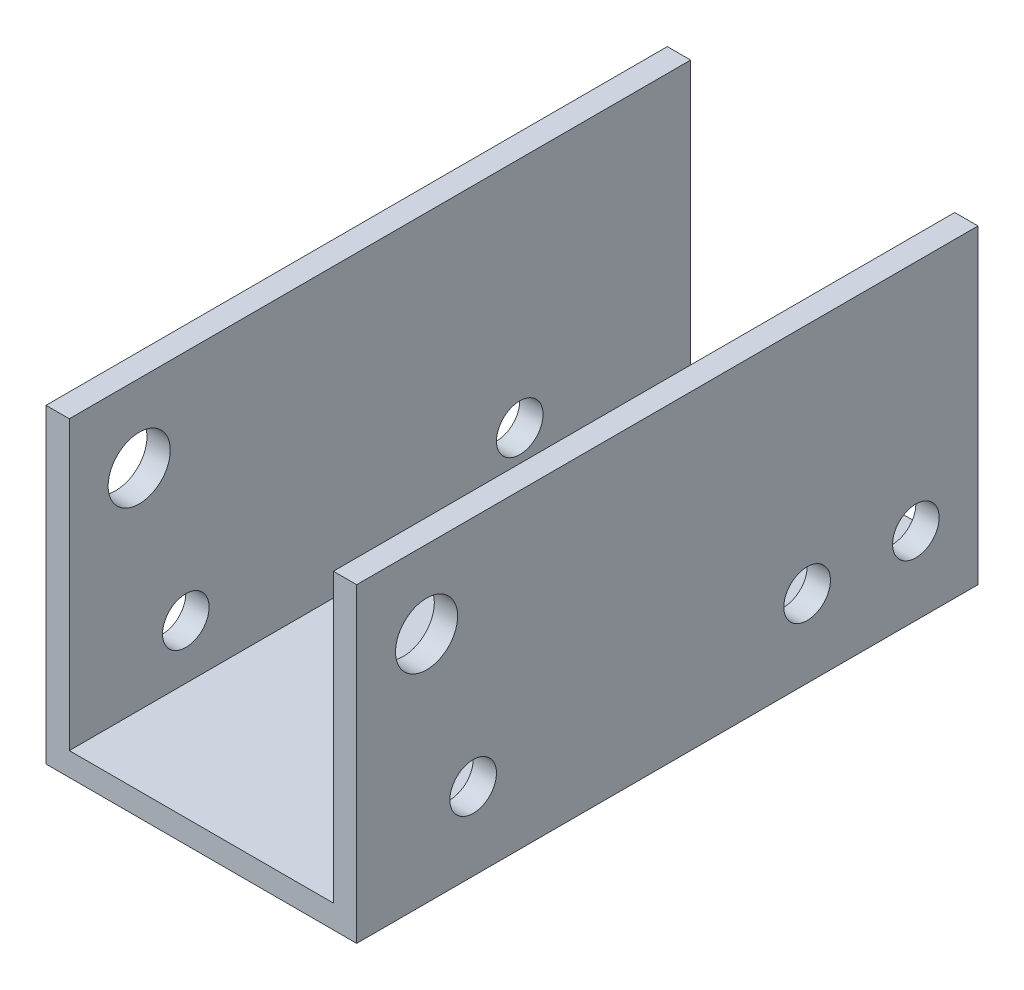
ISO-10303-21;
HEADER;
FILE_DESCRIPTION(('STEP AP214'),'2;1');
FILE_NAME('part.step','',(''),(''),'','','');
FILE_SCHEMA(('AUTOMOTIVE_DESIGN { 1 0 10303 214 1 1 1 1 }'));
ENDSEC;
DATA;
#1=APPLICATION_CONTEXT('core data for automotive mechanical design processes');
#2=APPLICATION_PROTOCOL_DEFINITION('international standard','automotive_design',2000,#1);
#3=PRODUCT_CONTEXT('',#1,'mechanical');
#4=PRODUCT('Part','Part','',(#3));
#5=PRODUCT_RELATED_PRODUCT_CATEGORY('part','',(#4));
#6=PRODUCT_DEFINITION_FORMATION('','',#4);
#7=PRODUCT_DEFINITION_CONTEXT('part definition',#1,'design');
#8=PRODUCT_DEFINITION('design','',#6,#7);
#9=PRODUCT_DEFINITION_SHAPE('','',#8);
#10=(LENGTH_UNIT() NAMED_UNIT(*) SI_UNIT(.MILLI.,.METRE.));
#11=(NAMED_UNIT(*) PLANE_ANGLE_UNIT() SI_UNIT($,.RADIAN.));
#12=(NAMED_UNIT(*) SI_UNIT($,.STERADIAN.) SOLID_ANGLE_UNIT());
#13=UNCERTAINTY_MEASURE_WITH_UNIT(LENGTH_MEASURE(1.E-05),#10,'distance_accuracy_value','');
#14=(GEOMETRIC_REPRESENTATION_CONTEXT(3) GLOBAL_UNCERTAINTY_ASSIGNED_CONTEXT((#13)) GLOBAL_UNIT_ASSIGNED_CONTEXT((#10,
#11,#12)) REPRESENTATION_CONTEXT('',''));
#15=CARTESIAN_POINT('',(0.,0.,0.));
#16=DIRECTION('',(0.,0.,1.));
#17=DIRECTION('',(1.,0.,0.));
#18=AXIS2_PLACEMENT_3D('',#15,#16,#17);
#19=CARTESIAN_POINT('',(-7.40483585351997,18.5,40.));
#20=DIRECTION('',(0.,-1.,0.));
#21=DIRECTION('',(1.,0.,0.));
#22=AXIS2_PLACEMENT_3D('',#19,#20,#21);
#23=PLANE('',#22);
#24=DIRECTION('',(-1.,0.,0.));
#25=VECTOR('',#24,1.);
#26=CARTESIAN_POINT('',(-7.40483585351997,18.5,0.));
#27=LINE('',#26,#25);
#28=CARTESIAN_POINT('',(-7.40483585351997,18.5,0.));
#29=VERTEX_POINT('',#28);
#30=CARTESIAN_POINT('',(-8.90483585351997,18.5,0.));
#31=VERTEX_POINT('',#30);
#32=EDGE_CURVE('E129',#29,#31,#27,.T.);
#33=ORIENTED_EDGE('',*,*,#32,.T.);
#34=DIRECTION('',(0.,0.,-1.));
#35=VECTOR('',#34,1.);
#36=CARTESIAN_POINT('',(-8.90483585351997,18.5,40.));
#37=LINE('',#36,#35);
#38=CARTESIAN_POINT('',(-8.90483585351997,18.5,40.));
#39=VERTEX_POINT('',#38);
#40=EDGE_CURVE('E11',#39,#31,#37,.T.);
#41=ORIENTED_EDGE('',*,*,#40,.F.);
#42=DIRECTION('',(-1.,0.,0.));
#43=VECTOR('',#42,1.);
#44=CARTESIAN_POINT('',(-7.40483585351997,18.5,40.));
#45=LINE('',#44,#43);
#46=CARTESIAN_POINT('',(-7.40483585351997,18.5,40.));
#47=VERTEX_POINT('',#46);
#48=EDGE_CURVE('E144',#47,#39,#45,.T.);
#49=ORIENTED_EDGE('',*,*,#48,.F.);
#50=DIRECTION('',(0.,0.,-1.));
#51=VECTOR('',#50,1.);
#52=CARTESIAN_POINT('',(-7.40483585351997,18.5,40.));
#53=LINE('',#52,#51);
#54=EDGE_CURVE('E125',#47,#29,#53,.T.);
#55=ORIENTED_EDGE('',*,*,#54,.T.);
#56=EDGE_LOOP('',(#33,#41,#49,#55));
#57=FACE_BOUND('',#56,.T.);
#58=ADVANCED_FACE('F31',(#57),#23,.F.);
#59=CARTESIAN_POINT('',(-8.90483585351997,18.5,40.));
#60=DIRECTION('',(1.,0.,0.));
#61=DIRECTION('',(0.,0.,-1.));
#62=AXIS2_PLACEMENT_3D('',#59,#60,#61);
#63=PLANE('',#62);
#64=CARTESIAN_POINT('',(-8.90483585351997,13.5,35.5));
#65=DIRECTION('',(1.,0.,0.));
#66=DIRECTION('',(0.,0.,-1.));
#67=AXIS2_PLACEMENT_3D('',#64,#65,#66);
#68=CIRCLE('',#67,2.);
#69=CARTESIAN_POINT('',(-8.90483585351997,13.5,33.5));
#70=VERTEX_POINT('',#69);
#71=EDGE_CURVE('E167',#70,#70,#68,.T.);
#72=ORIENTED_EDGE('',*,*,#71,.T.);
#73=EDGE_LOOP('',(#72));
#74=FACE_BOUND('',#73,.T.);
#75=CARTESIAN_POINT('',(-8.90483585351997,3.5,11.));
#76=DIRECTION('',(1.,0.,0.));
#77=DIRECTION('',(0.,0.,-1.));
#78=AXIS2_PLACEMENT_3D('',#75,#76,#77);
#79=CIRCLE('',#78,1.5);
#80=CARTESIAN_POINT('',(-8.90483585351997,3.5,9.5));
#81=VERTEX_POINT('',#80);
#82=EDGE_CURVE('E163',#81,#81,#79,.T.);
#83=ORIENTED_EDGE('',*,*,#82,.T.);
#84=EDGE_LOOP('',(#83));
#85=FACE_BOUND('',#84,.T.);
#86=CARTESIAN_POINT('',(-8.90483585351997,3.5,32.5));
#87=DIRECTION('',(1.,0.,0.));
#88=DIRECTION('',(0.,0.,-1.));
#89=AXIS2_PLACEMENT_3D('',#86,#87,#88);
#90=CIRCLE('',#89,1.5);
#91=CARTESIAN_POINT('',(-8.90483585351997,3.5,31.));
#92=VERTEX_POINT('',#91);
#93=EDGE_CURVE('E159',#92,#92,#90,.T.);
#94=ORIENTED_EDGE('',*,*,#93,.T.);
#95=EDGE_LOOP('',(#94));
#96=FACE_BOUND('',#95,.T.);
#97=DIRECTION('',(0.,-1.,0.));
#98=VECTOR('',#97,1.);
#99=CARTESIAN_POINT('',(-8.90483585351997,18.5,0.));
#100=LINE('',#99,#98);
#101=CARTESIAN_POINT('',(-8.90483585351997,-1.5,0.));
#102=VERTEX_POINT('',#101);
#103=EDGE_CURVE('E132',#31,#102,#100,.T.);
#104=ORIENTED_EDGE('',*,*,#103,.T.);
#105=DIRECTION('',(0.,0.,-1.));
#106=VECTOR('',#105,1.);
#107=CARTESIAN_POINT('',(-8.90483585351997,-1.5,40.));
#108=LINE('',#107,#106);
#109=CARTESIAN_POINT('',(-8.90483585351997,-1.5,40.));
#110=VERTEX_POINT('',#109);
#111=EDGE_CURVE('E40',#110,#102,#108,.T.);
#112=ORIENTED_EDGE('',*,*,#111,.F.);
#113=DIRECTION('',(0.,-1.,0.));
#114=VECTOR('',#113,1.);
#115=CARTESIAN_POINT('',(-8.90483585351997,18.5,40.));
#116=LINE('',#115,#114);
#117=EDGE_CURVE('E92',#39,#110,#116,.T.);
#118=ORIENTED_EDGE('',*,*,#117,.F.);
#119=ORIENTED_EDGE('',*,*,#40,.T.);
#120=EDGE_LOOP('',(#104,#112,#118,#119));
#121=FACE_BOUND('',#120,.T.);
#122=ADVANCED_FACE('F230',(#74,#85,#96,#121),#63,.F.);
#123=CARTESIAN_POINT('',(-8.90483585351997,-1.5,40.));
#124=DIRECTION('',(0.,1.,0.));
#125=DIRECTION('',(0.,0.,1.));
#126=AXIS2_PLACEMENT_3D('',#123,#124,#125);
#127=PLANE('',#126);
#128=DIRECTION('',(1.,0.,0.));
#129=VECTOR('',#128,1.);
#130=CARTESIAN_POINT('',(-8.90483585351997,-1.5,0.));
#131=LINE('',#130,#129);
#132=CARTESIAN_POINT('',(11.09516414648,-1.5,0.));
#133=VERTEX_POINT('',#132);
#134=EDGE_CURVE('E135',#102,#133,#131,.T.);
#135=ORIENTED_EDGE('',*,*,#134,.T.);
#136=DIRECTION('',(0.,0.,-1.));
#137=VECTOR('',#136,1.);
#138=CARTESIAN_POINT('',(11.09516414648,-1.5,40.));
#139=LINE('',#138,#137);
#140=CARTESIAN_POINT('',(11.09516414648,-1.5,40.));
#141=VERTEX_POINT('',#140);
#142=EDGE_CURVE('E151',#141,#133,#139,.T.);
#143=ORIENTED_EDGE('',*,*,#142,.F.);
#144=DIRECTION('',(1.,0.,0.));
#145=VECTOR('',#144,1.);
#146=CARTESIAN_POINT('',(-8.90483585351997,-1.5,40.));
#147=LINE('',#146,#145);
#148=EDGE_CURVE('E198',#110,#141,#147,.T.);
#149=ORIENTED_EDGE('',*,*,#148,.F.);
#150=ORIENTED_EDGE('',*,*,#111,.T.);
#151=EDGE_LOOP('',(#135,#143,#149,#150));
#152=FACE_BOUND('',#151,.T.);
#153=ADVANCED_FACE('F234',(#152),#127,.F.);
#154=CARTESIAN_POINT('',(11.09516414648,-1.5,40.));
#155=DIRECTION('',(-1.,0.,0.));
#156=DIRECTION('',(0.,0.,1.));
#157=AXIS2_PLACEMENT_3D('',#154,#155,#156);
#158=PLANE('',#157);
#159=CARTESIAN_POINT('',(11.09516414648,3.5,4.));
#160=DIRECTION('',(1.,0.,0.));
#161=DIRECTION('',(0.,0.,-1.));
#162=AXIS2_PLACEMENT_3D('',#159,#160,#161);
#163=CIRCLE('',#162,1.5);
#164=CARTESIAN_POINT('',(11.09516414648,3.5,2.5));
#165=VERTEX_POINT('',#164);
#166=EDGE_CURVE('E181',#165,#165,#163,.T.);
#167=ORIENTED_EDGE('',*,*,#166,.F.);
#168=EDGE_LOOP('',(#167));
#169=FACE_BOUND('',#168,.T.);
#170=CARTESIAN_POINT('',(11.09516414648,13.5,35.5));
#171=DIRECTION('',(1.,0.,0.));
#172=DIRECTION('',(0.,0.,-1.));
#173=AXIS2_PLACEMENT_3D('',#170,#171,#172);
#174=CIRCLE('',#173,2.);
#175=CARTESIAN_POINT('',(11.09516414648,13.5,33.5));
#176=VERTEX_POINT('',#175);
#177=EDGE_CURVE('E174',#176,#176,#174,.T.);
#178=ORIENTED_EDGE('',*,*,#177,.F.);
#179=EDGE_LOOP('',(#178));
#180=FACE_BOUND('',#179,.T.);
#181=CARTESIAN_POINT('',(11.09516414648,3.5,11.));
#182=DIRECTION('',(1.,0.,0.));
#183=DIRECTION('',(0.,0.,-1.));
#184=AXIS2_PLACEMENT_3D('',#181,#182,#183);
#185=CIRCLE('',#184,1.5);
#186=CARTESIAN_POINT('',(11.09516414648,3.5,9.5));
#187=VERTEX_POINT('',#186);
#188=EDGE_CURVE('E171',#187,#187,#185,.T.);
#189=ORIENTED_EDGE('',*,*,#188,.F.);
#190=EDGE_LOOP('',(#189));
#191=FACE_BOUND('',#190,.T.);
#192=CARTESIAN_POINT('',(11.09516414648,3.5,32.5));
#193=DIRECTION('',(1.,0.,0.));
#194=DIRECTION('',(0.,0.,-1.));
#195=AXIS2_PLACEMENT_3D('',#192,#193,#194);
#196=CIRCLE('',#195,1.5);
#197=CARTESIAN_POINT('',(11.09516414648,3.5,31.));
#198=VERTEX_POINT('',#197);
#199=EDGE_CURVE('E189',#198,#198,#196,.T.);
#200=ORIENTED_EDGE('',*,*,#199,.F.);
#201=EDGE_LOOP('',(#200));
#202=FACE_BOUND('',#201,.T.);
#203=DIRECTION('',(0.,1.,0.));
#204=VECTOR('',#203,1.);
#205=CARTESIAN_POINT('',(11.09516414648,-1.5,0.));
#206=LINE('',#205,#204);
#207=CARTESIAN_POINT('',(11.09516414648,18.5,0.));
#208=VERTEX_POINT('',#207);
#209=EDGE_CURVE('E137',#133,#208,#206,.T.);
#210=ORIENTED_EDGE('',*,*,#209,.T.);
#211=DIRECTION('',(0.,0.,-1.));
#212=VECTOR('',#211,1.);
#213=CARTESIAN_POINT('',(11.09516414648,18.5,40.));
#214=LINE('',#213,#212);
#215=CARTESIAN_POINT('',(11.09516414648,18.5,40.));
#216=VERTEX_POINT('',#215);
#217=EDGE_CURVE('E148',#216,#208,#214,.T.);
#218=ORIENTED_EDGE('',*,*,#217,.F.);
#219=DIRECTION('',(0.,1.,0.));
#220=VECTOR('',#219,1.);
#221=CARTESIAN_POINT('',(11.09516414648,-1.5,40.));
#222=LINE('',#221,#220);
#223=EDGE_CURVE('E200',#141,#216,#222,.T.);
#224=ORIENTED_EDGE('',*,*,#223,.F.);
#225=ORIENTED_EDGE('',*,*,#142,.T.);
#226=EDGE_LOOP('',(#210,#218,#224,#225));
#227=FACE_BOUND('',#226,.T.);
#228=ADVANCED_FACE('F206',(#169,#180,#191,#202,#227),#158,.F.);
#229=CARTESIAN_POINT('',(11.09516414648,18.5,40.));
#230=DIRECTION('',(0.,-1.,0.));
#231=DIRECTION('',(0.,0.,-1.));
#232=AXIS2_PLACEMENT_3D('',#229,#230,#231);
#233=PLANE('',#232);
#234=DIRECTION('',(-1.,0.,0.));
#235=VECTOR('',#234,1.);
#236=CARTESIAN_POINT('',(11.09516414648,18.5,0.));
#237=LINE('',#236,#235);
#238=CARTESIAN_POINT('',(9.59516414648003,18.5,0.));
#239=VERTEX_POINT('',#238);
#240=EDGE_CURVE('E139',#208,#239,#237,.T.);
#241=ORIENTED_EDGE('',*,*,#240,.T.);
#242=DIRECTION('',(0.,0.,-1.));
#243=VECTOR('',#242,1.);
#244=CARTESIAN_POINT('',(9.59516414648003,18.5,40.));
#245=LINE('',#244,#243);
#246=CARTESIAN_POINT('',(9.59516414648003,18.5,40.));
#247=VERTEX_POINT('',#246);
#248=EDGE_CURVE('E120',#247,#239,#245,.T.);
#249=ORIENTED_EDGE('',*,*,#248,.F.);
#250=DIRECTION('',(-1.,0.,0.));
#251=VECTOR('',#250,1.);
#252=CARTESIAN_POINT('',(11.09516414648,18.5,40.));
#253=LINE('',#252,#251);
#254=EDGE_CURVE('E111',#216,#247,#253,.T.);
#255=ORIENTED_EDGE('',*,*,#254,.F.);
#256=ORIENTED_EDGE('',*,*,#217,.T.);
#257=EDGE_LOOP('',(#241,#249,#255,#256));
#258=FACE_BOUND('',#257,.T.);
#259=ADVANCED_FACE('F210',(#258),#233,.F.);
#260=CARTESIAN_POINT('',(9.59516414648003,18.5,40.));
#261=DIRECTION('',(1.,0.,0.));
#262=DIRECTION('',(0.,0.,-1.));
#263=AXIS2_PLACEMENT_3D('',#260,#261,#262);
#264=PLANE('',#263);
#265=CARTESIAN_POINT('',(9.59516414648003,3.5,4.));
#266=DIRECTION('',(1.,0.,0.));
#267=DIRECTION('',(0.,0.,-1.));
#268=AXIS2_PLACEMENT_3D('',#265,#266,#267);
#269=CIRCLE('',#268,1.5);
#270=CARTESIAN_POINT('',(9.59516414648003,3.5,2.5));
#271=VERTEX_POINT('',#270);
#272=EDGE_CURVE('E34',#271,#271,#269,.T.);
#273=ORIENTED_EDGE('',*,*,#272,.T.);
#274=EDGE_LOOP('',(#273));
#275=FACE_BOUND('',#274,.T.);
#276=CARTESIAN_POINT('',(9.59516414648003,13.5,35.5));
#277=DIRECTION('',(1.,0.,0.));
#278=DIRECTION('',(0.,0.,-1.));
#279=AXIS2_PLACEMENT_3D('',#276,#277,#278);
#280=CIRCLE('',#279,2.);
#281=CARTESIAN_POINT('',(9.59516414648003,13.5,33.5));
#282=VERTEX_POINT('',#281);
#283=EDGE_CURVE('E166',#282,#282,#280,.T.);
#284=ORIENTED_EDGE('',*,*,#283,.T.);
#285=EDGE_LOOP('',(#284));
#286=FACE_BOUND('',#285,.T.);
#287=CARTESIAN_POINT('',(9.59516414648003,3.5,11.));
#288=DIRECTION('',(1.,0.,0.));
#289=DIRECTION('',(0.,0.,-1.));
#290=AXIS2_PLACEMENT_3D('',#287,#288,#289);
#291=CIRCLE('',#290,1.5);
#292=CARTESIAN_POINT('',(9.59516414648003,3.5,9.5));
#293=VERTEX_POINT('',#292);
#294=EDGE_CURVE('E162',#293,#293,#291,.T.);
#295=ORIENTED_EDGE('',*,*,#294,.T.);
#296=EDGE_LOOP('',(#295));
#297=FACE_BOUND('',#296,.T.);
#298=CARTESIAN_POINT('',(9.59516414648003,3.5,32.5));
#299=DIRECTION('',(1.,0.,0.));
#300=DIRECTION('',(0.,0.,-1.));
#301=AXIS2_PLACEMENT_3D('',#298,#299,#300);
#302=CIRCLE('',#301,1.5);
#303=CARTESIAN_POINT('',(9.59516414648003,3.5,31.));
#304=VERTEX_POINT('',#303);
#305=EDGE_CURVE('E133',#304,#304,#302,.T.);
#306=ORIENTED_EDGE('',*,*,#305,.T.);
#307=EDGE_LOOP('',(#306));
#308=FACE_BOUND('',#307,.T.);
#309=DIRECTION('',(0.,-1.,0.));
#310=VECTOR('',#309,1.);
#311=CARTESIAN_POINT('',(9.59516414648003,18.5,0.));
#312=LINE('',#311,#310);
#313=CARTESIAN_POINT('',(9.59516414648003,0.,0.));
#314=VERTEX_POINT('',#313);
#315=EDGE_CURVE('E119',#239,#314,#312,.T.);
#316=ORIENTED_EDGE('',*,*,#315,.T.);
#317=DIRECTION('',(0.,0.,-1.));
#318=VECTOR('',#317,1.);
#319=CARTESIAN_POINT('',(9.59516414648003,0.,40.));
#320=LINE('',#319,#318);
#321=CARTESIAN_POINT('',(9.59516414648003,0.,40.));
#322=VERTEX_POINT('',#321);
#323=EDGE_CURVE('E116',#322,#314,#320,.T.);
#324=ORIENTED_EDGE('',*,*,#323,.F.);
#325=DIRECTION('',(0.,-1.,0.));
#326=VECTOR('',#325,1.);
#327=CARTESIAN_POINT('',(9.59516414648003,18.5,40.));
#328=LINE('',#327,#326);
#329=EDGE_CURVE('E105',#247,#322,#328,.T.);
#330=ORIENTED_EDGE('',*,*,#329,.F.);
#331=ORIENTED_EDGE('',*,*,#248,.T.);
#332=EDGE_LOOP('',(#316,#324,#330,#331));
#333=FACE_BOUND('',#332,.T.);
#334=ADVANCED_FACE('F117',(#275,#286,#297,#308,#333),#264,.F.);
#335=CARTESIAN_POINT('',(9.59516414648003,0.,40.));
#336=DIRECTION('',(0.,-1.,0.));
#337=DIRECTION('',(1.,0.,0.));
#338=AXIS2_PLACEMENT_3D('',#335,#336,#337);
#339=PLANE('',#338);
#340=DIRECTION('',(-1.,0.,0.));
#341=VECTOR('',#340,1.);
#342=CARTESIAN_POINT('',(9.59516414648003,0.,0.));
#343=LINE('',#342,#341);
#344=CARTESIAN_POINT('',(-7.40483585351997,0.,0.));
#345=VERTEX_POINT('',#344);
#346=EDGE_CURVE('E78',#314,#345,#343,.T.);
#347=ORIENTED_EDGE('',*,*,#346,.T.);
#348=DIRECTION('',(0.,0.,-1.));
#349=VECTOR('',#348,1.);
#350=CARTESIAN_POINT('',(-7.40483585351997,0.,40.));
#351=LINE('',#350,#349);
#352=CARTESIAN_POINT('',(-7.40483585351997,0.,40.));
#353=VERTEX_POINT('',#352);
#354=EDGE_CURVE('E121',#353,#345,#351,.T.);
#355=ORIENTED_EDGE('',*,*,#354,.F.);
#356=DIRECTION('',(-1.,0.,0.));
#357=VECTOR('',#356,1.);
#358=CARTESIAN_POINT('',(9.59516414648003,0.,40.));
#359=LINE('',#358,#357);
#360=EDGE_CURVE('E109',#322,#353,#359,.T.);
#361=ORIENTED_EDGE('',*,*,#360,.F.);
#362=ORIENTED_EDGE('',*,*,#323,.T.);
#363=EDGE_LOOP('',(#347,#355,#361,#362));
#364=FACE_BOUND('',#363,.T.);
#365=ADVANCED_FACE('F123',(#364),#339,.F.);
#366=CARTESIAN_POINT('',(-7.40483585351997,0.,40.));
#367=DIRECTION('',(-1.,0.,0.));
#368=DIRECTION('',(0.,-1.,0.));
#369=AXIS2_PLACEMENT_3D('',#366,#367,#368);
#370=PLANE('',#369);
#371=CARTESIAN_POINT('',(-7.40483585351997,13.5,35.5));
#372=DIRECTION('',(-1.,0.,0.));
#373=DIRECTION('',(0.,-1.,0.));
#374=AXIS2_PLACEMENT_3D('',#371,#372,#373);
#375=CIRCLE('',#374,2.);
#376=CARTESIAN_POINT('',(-7.40483585351997,11.5,35.5));
#377=VERTEX_POINT('',#376);
#378=EDGE_CURVE('E164',#377,#377,#375,.T.);
#379=ORIENTED_EDGE('',*,*,#378,.T.);
#380=EDGE_LOOP('',(#379));
#381=FACE_BOUND('',#380,.T.);
#382=CARTESIAN_POINT('',(-7.40483585351997,3.5,11.));
#383=DIRECTION('',(-1.,0.,0.));
#384=DIRECTION('',(0.,-1.,0.));
#385=AXIS2_PLACEMENT_3D('',#382,#383,#384);
#386=CIRCLE('',#385,1.5);
#387=CARTESIAN_POINT('',(-7.40483585351997,2.,11.));
#388=VERTEX_POINT('',#387);
#389=EDGE_CURVE('E160',#388,#388,#386,.T.);
#390=ORIENTED_EDGE('',*,*,#389,.T.);
#391=EDGE_LOOP('',(#390));
#392=FACE_BOUND('',#391,.T.);
#393=CARTESIAN_POINT('',(-7.40483585351997,3.5,32.5));
#394=DIRECTION('',(-1.,0.,0.));
#395=DIRECTION('',(0.,-1.,0.));
#396=AXIS2_PLACEMENT_3D('',#393,#394,#395);
#397=CIRCLE('',#396,1.5);
#398=CARTESIAN_POINT('',(-7.40483585351997,2.,32.5));
#399=VERTEX_POINT('',#398);
#400=EDGE_CURVE('E156',#399,#399,#397,.T.);
#401=ORIENTED_EDGE('',*,*,#400,.T.);
#402=EDGE_LOOP('',(#401));
#403=FACE_BOUND('',#402,.T.);
#404=DIRECTION('',(0.,1.,0.));
#405=VECTOR('',#404,1.);
#406=CARTESIAN_POINT('',(-7.40483585351997,0.,0.));
#407=LINE('',#406,#405);
#408=EDGE_CURVE('E84',#345,#29,#407,.T.);
#409=ORIENTED_EDGE('',*,*,#408,.T.);
#410=ORIENTED_EDGE('',*,*,#54,.F.);
#411=DIRECTION('',(0.,1.,0.));
#412=VECTOR('',#411,1.);
#413=CARTESIAN_POINT('',(-7.40483585351997,0.,40.));
#414=LINE('',#413,#412);
#415=EDGE_CURVE('E49',#353,#47,#414,.T.);
#416=ORIENTED_EDGE('',*,*,#415,.F.);
#417=ORIENTED_EDGE('',*,*,#354,.T.);
#418=EDGE_LOOP('',(#409,#410,#416,#417));
#419=FACE_BOUND('',#418,.T.);
#420=ADVANCED_FACE('F218',(#381,#392,#403,#419),#370,.F.);
#421=CARTESIAN_POINT('',(-8.90483585351997,18.5,40.));
#422=DIRECTION('',(0.,0.,1.));
#423=DIRECTION('',(1.,0.,0.));
#424=AXIS2_PLACEMENT_3D('',#421,#422,#423);
#425=PLANE('',#424);
#426=ORIENTED_EDGE('',*,*,#48,.T.);
#427=ORIENTED_EDGE('',*,*,#117,.T.);
#428=ORIENTED_EDGE('',*,*,#148,.T.);
#429=ORIENTED_EDGE('',*,*,#223,.T.);
#430=ORIENTED_EDGE('',*,*,#254,.T.);
#431=ORIENTED_EDGE('',*,*,#329,.T.);
#432=ORIENTED_EDGE('',*,*,#360,.T.);
#433=ORIENTED_EDGE('',*,*,#415,.T.);
#434=EDGE_LOOP('',(#426,#427,#428,#429,#430,#431,#432,#433));
#435=FACE_BOUND('',#434,.T.);
#436=ADVANCED_FACE('F107',(#435),#425,.T.);
#437=CARTESIAN_POINT('',(-8.90483585351997,18.5,0.));
#438=DIRECTION('',(0.,0.,1.));
#439=DIRECTION('',(1.,0.,0.));
#440=AXIS2_PLACEMENT_3D('',#437,#438,#439);
#441=PLANE('',#440);
#442=ORIENTED_EDGE('',*,*,#32,.F.);
#443=ORIENTED_EDGE('',*,*,#408,.F.);
#444=ORIENTED_EDGE('',*,*,#346,.F.);
#445=ORIENTED_EDGE('',*,*,#315,.F.);
#446=ORIENTED_EDGE('',*,*,#240,.F.);
#447=ORIENTED_EDGE('',*,*,#209,.F.);
#448=ORIENTED_EDGE('',*,*,#134,.F.);
#449=ORIENTED_EDGE('',*,*,#103,.F.);
#450=EDGE_LOOP('',(#442,#443,#444,#445,#446,#447,#448,#449));
#451=FACE_BOUND('',#450,.T.);
#452=ADVANCED_FACE('F213',(#451),#441,.F.);
#453=CARTESIAN_POINT('',(-8.90483585351997,3.5,32.5));
#454=DIRECTION('',(1.,0.,0.));
#455=DIRECTION('',(0.,0.,-1.));
#456=AXIS2_PLACEMENT_3D('',#453,#454,#455);
#457=CYLINDRICAL_SURFACE('',#456,1.5);
#458=ORIENTED_EDGE('',*,*,#93,.F.);
#459=EDGE_LOOP('',(#458));
#460=FACE_BOUND('',#459,.T.);
#461=ORIENTED_EDGE('',*,*,#400,.F.);
#462=EDGE_LOOP('',(#461));
#463=FACE_BOUND('',#462,.T.);
#464=ADVANCED_FACE('F263',(#460,#463),#457,.F.);
#465=ORIENTED_EDGE('',*,*,#199,.T.);
#466=EDGE_LOOP('',(#465));
#467=FACE_BOUND('',#466,.T.);
#468=ORIENTED_EDGE('',*,*,#305,.F.);
#469=EDGE_LOOP('',(#468));
#470=FACE_BOUND('',#469,.T.);
#471=ADVANCED_FACE('F260',(#467,#470),#457,.F.);
#472=CARTESIAN_POINT('',(-8.90483585351997,3.5,11.));
#473=DIRECTION('',(1.,0.,0.));
#474=DIRECTION('',(0.,0.,-1.));
#475=AXIS2_PLACEMENT_3D('',#472,#473,#474);
#476=CYLINDRICAL_SURFACE('',#475,1.5);
#477=ORIENTED_EDGE('',*,*,#82,.F.);
#478=EDGE_LOOP('',(#477));
#479=FACE_BOUND('',#478,.T.);
#480=ORIENTED_EDGE('',*,*,#389,.F.);
#481=EDGE_LOOP('',(#480));
#482=FACE_BOUND('',#481,.T.);
#483=ADVANCED_FACE('F262',(#479,#482),#476,.F.);
#484=ORIENTED_EDGE('',*,*,#188,.T.);
#485=EDGE_LOOP('',(#484));
#486=FACE_BOUND('',#485,.T.);
#487=ORIENTED_EDGE('',*,*,#294,.F.);
#488=EDGE_LOOP('',(#487));
#489=FACE_BOUND('',#488,.T.);
#490=ADVANCED_FACE('F270',(#486,#489),#476,.F.);
#491=CARTESIAN_POINT('',(-8.90483585351997,13.5,35.5));
#492=DIRECTION('',(1.,0.,0.));
#493=DIRECTION('',(0.,0.,-1.));
#494=AXIS2_PLACEMENT_3D('',#491,#492,#493);
#495=CYLINDRICAL_SURFACE('',#494,2.);
#496=ORIENTED_EDGE('',*,*,#71,.F.);
#497=EDGE_LOOP('',(#496));
#498=FACE_BOUND('',#497,.T.);
#499=ORIENTED_EDGE('',*,*,#378,.F.);
#500=EDGE_LOOP('',(#499));
#501=FACE_BOUND('',#500,.T.);
#502=ADVANCED_FACE('F305',(#498,#501),#495,.F.);
#503=ORIENTED_EDGE('',*,*,#177,.T.);
#504=EDGE_LOOP('',(#503));
#505=FACE_BOUND('',#504,.T.);
#506=ORIENTED_EDGE('',*,*,#283,.F.);
#507=EDGE_LOOP('',(#506));
#508=FACE_BOUND('',#507,.T.);
#509=ADVANCED_FACE('F314',(#505,#508),#495,.F.);
#510=CARTESIAN_POINT('',(5.09516414648003,3.5,4.));
#511=DIRECTION('',(1.,0.,0.));
#512=DIRECTION('',(0.,0.,-1.));
#513=AXIS2_PLACEMENT_3D('',#510,#511,#512);
#514=CYLINDRICAL_SURFACE('',#513,1.5);
#515=ORIENTED_EDGE('',*,*,#166,.T.);
#516=EDGE_LOOP('',(#515));
#517=FACE_BOUND('',#516,.T.);
#518=ORIENTED_EDGE('',*,*,#272,.F.);
#519=EDGE_LOOP('',(#518));
#520=FACE_BOUND('',#519,.T.);
#521=ADVANCED_FACE('F323',(#517,#520),#514,.F.);
#522=CLOSED_SHELL('',(#58,#122,#153,#228,#259,#334,#365,#420,#436,#452,#464,#471,#483,#490,#502,
#509,#521));
#523=MANIFOLD_SOLID_BREP('B2',#522);
#524=ADVANCED_BREP_SHAPE_REPRESENTATION('',(#18,#523),#14);
#525=SHAPE_DEFINITION_REPRESENTATION(#9,#524);
ENDSEC;
END-ISO-10303-21;
